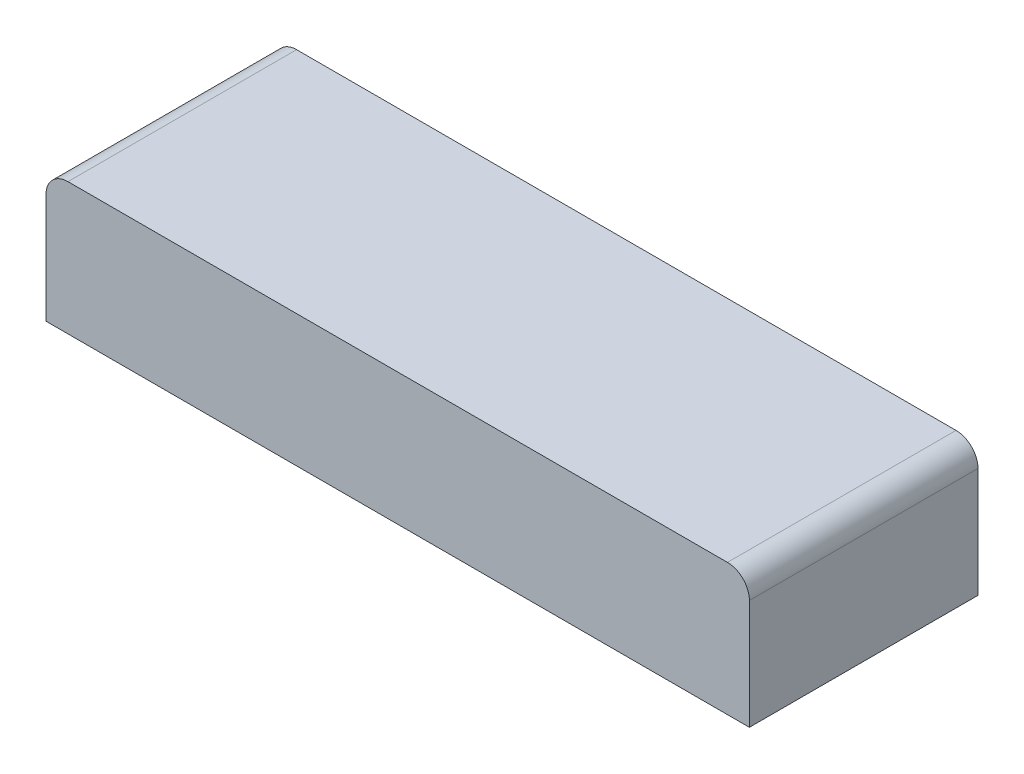
ISO-10303-21;
HEADER;
FILE_DESCRIPTION(('STEP AP214'),'2;1');
FILE_NAME('part.step','',(''),(''),'','','');
FILE_SCHEMA(('AUTOMOTIVE_DESIGN { 1 0 10303 214 1 1 1 1 }'));
ENDSEC;
DATA;
#1=APPLICATION_CONTEXT('core data for automotive mechanical design processes');
#2=APPLICATION_PROTOCOL_DEFINITION('international standard','automotive_design',2000,#1);
#3=PRODUCT_CONTEXT('',#1,'mechanical');
#4=PRODUCT('Part','Part','',(#3));
#5=PRODUCT_RELATED_PRODUCT_CATEGORY('part','',(#4));
#6=PRODUCT_DEFINITION_FORMATION('','',#4);
#7=PRODUCT_DEFINITION_CONTEXT('part definition',#1,'design');
#8=PRODUCT_DEFINITION('design','',#6,#7);
#9=PRODUCT_DEFINITION_SHAPE('','',#8);
#10=(LENGTH_UNIT() NAMED_UNIT(*) SI_UNIT(.MILLI.,.METRE.));
#11=(NAMED_UNIT(*) PLANE_ANGLE_UNIT() SI_UNIT($,.RADIAN.));
#12=(NAMED_UNIT(*) SI_UNIT($,.STERADIAN.) SOLID_ANGLE_UNIT());
#13=UNCERTAINTY_MEASURE_WITH_UNIT(LENGTH_MEASURE(1.E-05),#10,'distance_accuracy_value','');
#14=(GEOMETRIC_REPRESENTATION_CONTEXT(3) GLOBAL_UNCERTAINTY_ASSIGNED_CONTEXT((#13)) GLOBAL_UNIT_ASSIGNED_CONTEXT((#10,
#11,#12)) REPRESENTATION_CONTEXT('',''));
#15=CARTESIAN_POINT('',(0.,0.,0.));
#16=DIRECTION('',(0.,0.,1.));
#17=DIRECTION('',(1.,0.,0.));
#18=AXIS2_PLACEMENT_3D('',#15,#16,#17);
#19=CARTESIAN_POINT('',(11.500006908199,-7.300000791134,0.));
#20=DIRECTION('',(0.,0.,1.));
#21=DIRECTION('',(1.,0.,0.));
#22=AXIS2_PLACEMENT_3D('',#19,#20,#21);
#23=CYLINDRICAL_SURFACE('',#22,0.1);
#24=CARTESIAN_POINT('',(11.500006908199,-7.300000791134,1.07));
#25=DIRECTION('',(0.,0.,1.));
#26=DIRECTION('',(1.,0.,0.));
#27=AXIS2_PLACEMENT_3D('',#24,#25,#26);
#28=CIRCLE('',#27,0.1);
#29=CARTESIAN_POINT('',(11.4000069300541,-7.300000795505,1.07));
#30=VERTEX_POINT('',#29);
#31=CARTESIAN_POINT('',(11.5000069038275,-7.2000007911343,1.07));
#32=VERTEX_POINT('',#31);
#33=EDGE_CURVE('E106',#30,#32,#28,.F.);
#34=ORIENTED_EDGE('',*,*,#33,.T.);
#35=DIRECTION('',(0.,0.,1.));
#36=VECTOR('',#35,1.);
#37=CARTESIAN_POINT('',(11.500006899456,-7.20000079113461,0.));
#38=LINE('',#37,#36);
#39=CARTESIAN_POINT('',(11.5000069038275,-7.2000006600003,0.03));
#40=VERTEX_POINT('',#39);
#41=EDGE_CURVE('E123',#40,#32,#38,.T.);
#42=ORIENTED_EDGE('',*,*,#41,.F.);
#43=CARTESIAN_POINT('',(11.500006908199,-7.300000791134,0.03));
#44=DIRECTION('',(0.,0.,1.));
#45=DIRECTION('',(1.,0.,0.));
#46=AXIS2_PLACEMENT_3D('',#43,#44,#45);
#47=CIRCLE('',#46,0.1);
#48=CARTESIAN_POINT('',(11.4000069081986,-7.300000795505,0.03));
#49=VERTEX_POINT('',#48);
#50=EDGE_CURVE('E91',#40,#49,#47,.T.);
#51=ORIENTED_EDGE('',*,*,#50,.T.);
#52=DIRECTION('',(0.,0.,1.));
#53=VECTOR('',#52,1.);
#54=CARTESIAN_POINT('',(11.4000069081983,-7.300000799876,0.));
#55=LINE('',#54,#53);
#56=EDGE_CURVE('E79',#30,#49,#55,.F.);
#57=ORIENTED_EDGE('',*,*,#56,.F.);
#58=EDGE_LOOP('',(#34,#42,#51,#57));
#59=FACE_BOUND('',#58,.T.);
#60=ADVANCED_FACE('F17',(#59),#23,.T.);
#61=CARTESIAN_POINT('',(14.600006899456,-7.200000520124,0.));
#62=DIRECTION('',(-8.74227765734797E-08,0.999999999999996,0.));
#63=DIRECTION('',(-0.999999999999996,-8.74227765734797E-08,0.));
#64=AXIS2_PLACEMENT_3D('',#61,#62,#63);
#65=PLANE('',#64);
#66=DIRECTION('',(-1.,0.,0.));
#67=VECTOR('',#66,1.);
#68=CARTESIAN_POINT('',(13.000006969395,-7.200000791134,1.07));
#69=LINE('',#68,#67);
#70=CARTESIAN_POINT('',(14.5000069038275,-7.20000066,1.07));
#71=VERTEX_POINT('',#70);
#72=EDGE_CURVE('E105',#32,#71,#69,.F.);
#73=ORIENTED_EDGE('',*,*,#72,.T.);
#74=DIRECTION('',(0.,0.,1.));
#75=VECTOR('',#74,1.);
#76=CARTESIAN_POINT('',(14.500006899456,-7.200000528866,0.));
#77=LINE('',#76,#75);
#78=CARTESIAN_POINT('',(14.5000069038275,-7.200000528866,0.03));
#79=VERTEX_POINT('',#78);
#80=EDGE_CURVE('E121',#79,#71,#77,.T.);
#81=ORIENTED_EDGE('',*,*,#80,.F.);
#82=DIRECTION('',(1.,0.,0.));
#83=VECTOR('',#82,1.);
#84=CARTESIAN_POINT('',(13.000006969395,-7.200000528866,0.03));
#85=LINE('',#84,#83);
#86=EDGE_CURVE('E76',#79,#40,#85,.F.);
#87=ORIENTED_EDGE('',*,*,#86,.T.);
#88=ORIENTED_EDGE('',*,*,#41,.T.);
#89=EDGE_LOOP('',(#73,#81,#87,#88));
#90=FACE_BOUND('',#89,.T.);
#91=ADVANCED_FACE('F142',(#90),#65,.T.);
#92=CARTESIAN_POINT('',(14.500006908199,-7.300000528866,0.));
#93=DIRECTION('',(0.,0.,1.));
#94=DIRECTION('',(1.,0.,0.));
#95=AXIS2_PLACEMENT_3D('',#92,#93,#94);
#96=CYLINDRICAL_SURFACE('',#95,0.1);
#97=CARTESIAN_POINT('',(14.500006908199,-7.300000528866,1.07));
#98=DIRECTION('',(0.,0.,1.));
#99=DIRECTION('',(1.,0.,0.));
#100=AXIS2_PLACEMENT_3D('',#97,#98,#99);
#101=CIRCLE('',#100,0.1);
#102=CARTESIAN_POINT('',(14.6000069081989,-7.300000524495,1.07));
#103=VERTEX_POINT('',#102);
#104=EDGE_CURVE('E83',#71,#103,#101,.F.);
#105=ORIENTED_EDGE('',*,*,#104,.T.);
#106=DIRECTION('',(0.,0.,1.));
#107=VECTOR('',#106,1.);
#108=CARTESIAN_POINT('',(14.6000069081988,-7.300000520124,0.));
#109=LINE('',#108,#107);
#110=CARTESIAN_POINT('',(14.6000069081988,-7.30000052012386,0.03));
#111=VERTEX_POINT('',#110);
#112=EDGE_CURVE('E80',#111,#103,#109,.T.);
#113=ORIENTED_EDGE('',*,*,#112,.F.);
#114=CARTESIAN_POINT('',(14.500006908199,-7.300000528866,0.03));
#115=DIRECTION('',(0.,0.,1.));
#116=DIRECTION('',(1.,0.,0.));
#117=AXIS2_PLACEMENT_3D('',#114,#115,#116);
#118=CIRCLE('',#117,0.1);
#119=EDGE_CURVE('E20',#111,#79,#118,.T.);
#120=ORIENTED_EDGE('',*,*,#119,.T.);
#121=ORIENTED_EDGE('',*,*,#80,.T.);
#122=EDGE_LOOP('',(#105,#113,#120,#121));
#123=FACE_BOUND('',#122,.T.);
#124=ADVANCED_FACE('F81',(#123),#96,.T.);
#125=CARTESIAN_POINT('',(11.400006899456,-7.200000799876,0.));
#126=DIRECTION('',(-0.999999999999996,-8.74227765734797E-08,0.));
#127=DIRECTION('',(8.74227765734797E-08,-0.999999999999996,0.));
#128=AXIS2_PLACEMENT_3D('',#125,#126,#127);
#129=PLANE('',#128);
#130=ORIENTED_EDGE('',*,*,#56,.T.);
#131=DIRECTION('',(0.,1.,0.));
#132=VECTOR('',#131,1.);
#133=CARTESIAN_POINT('',(11.400006908199,-8.00000066,0.03));
#134=LINE('',#133,#132);
#135=CARTESIAN_POINT('',(11.400006933697,-7.8000007998764,0.03));
#136=VERTEX_POINT('',#135);
#137=EDGE_CURVE('E89',#49,#136,#134,.F.);
#138=ORIENTED_EDGE('',*,*,#137,.T.);
#139=DIRECTION('',(0.,0.,1.));
#140=VECTOR('',#139,1.);
#141=CARTESIAN_POINT('',(11.40000695191,-7.80000079987661,0.55));
#142=LINE('',#141,#140);
#143=CARTESIAN_POINT('',(11.4000069519099,-7.8000006600003,1.07));
#144=VERTEX_POINT('',#143);
#145=EDGE_CURVE('E101',#144,#136,#142,.F.);
#146=ORIENTED_EDGE('',*,*,#145,.F.);
#147=DIRECTION('',(0.,1.,0.));
#148=VECTOR('',#147,1.);
#149=CARTESIAN_POINT('',(11.40000695191,-8.00000066,1.07));
#150=LINE('',#149,#148);
#151=EDGE_CURVE('E84',#144,#30,#150,.T.);
#152=ORIENTED_EDGE('',*,*,#151,.T.);
#153=EDGE_LOOP('',(#130,#138,#146,#152));
#154=FACE_BOUND('',#153,.T.);
#155=ADVANCED_FACE('F138',(#154),#129,.T.);
#156=CARTESIAN_POINT('',(13.000006969395,-8.00000066,0.03));
#157=DIRECTION('',(0.,0.,1.));
#158=DIRECTION('',(1.,0.,0.));
#159=AXIS2_PLACEMENT_3D('',#156,#157,#158);
#160=PLANE('',#159);
#161=ORIENTED_EDGE('',*,*,#137,.F.);
#162=ORIENTED_EDGE('',*,*,#50,.F.);
#163=ORIENTED_EDGE('',*,*,#86,.F.);
#164=ORIENTED_EDGE('',*,*,#119,.F.);
#165=DIRECTION('',(-8.74227765734797E-08,0.999999999999996,0.));
#166=VECTOR('',#165,1.);
#167=CARTESIAN_POINT('',(14.600007039333,-8.800000520124,0.03));
#168=LINE('',#167,#166);
#169=CARTESIAN_POINT('',(14.6000069519101,-7.80000059006183,0.03));
#170=VERTEX_POINT('',#169);
#171=EDGE_CURVE('E73',#170,#111,#168,.T.);
#172=ORIENTED_EDGE('',*,*,#171,.F.);
#173=DIRECTION('',(0.999999999999996,8.74227765734797E-08,0.));
#174=VECTOR('',#173,1.);
#175=CARTESIAN_POINT('',(14.50000695191,-7.800000528866,0.03));
#176=LINE('',#175,#174);
#177=EDGE_CURVE('E99',#136,#170,#176,.T.);
#178=ORIENTED_EDGE('',*,*,#177,.F.);
#179=EDGE_LOOP('',(#161,#162,#163,#164,#172,#178));
#180=FACE_BOUND('',#179,.T.);
#181=ADVANCED_FACE('F70',(#180),#160,.F.);
#182=CARTESIAN_POINT('',(14.600007039333,-8.800000520124,0.));
#183=DIRECTION('',(0.999999999999996,8.74227765734797E-08,0.));
#184=DIRECTION('',(-8.74227765734797E-08,0.999999999999996,0.));
#185=AXIS2_PLACEMENT_3D('',#182,#183,#184);
#186=PLANE('',#185);
#187=ORIENTED_EDGE('',*,*,#112,.T.);
#188=DIRECTION('',(0.,1.,0.));
#189=VECTOR('',#188,1.);
#190=CARTESIAN_POINT('',(14.600006908199,-8.00000066,1.07));
#191=LINE('',#190,#189);
#192=CARTESIAN_POINT('',(14.600006908199,-7.800000520124,1.07));
#193=VERTEX_POINT('',#192);
#194=EDGE_CURVE('E35',#103,#193,#191,.F.);
#195=ORIENTED_EDGE('',*,*,#194,.T.);
#196=DIRECTION('',(0.,0.,1.));
#197=VECTOR('',#196,1.);
#198=CARTESIAN_POINT('',(14.60000695191,-7.80000052012372,0.55));
#199=LINE('',#198,#197);
#200=EDGE_CURVE('E26',#170,#193,#199,.T.);
#201=ORIENTED_EDGE('',*,*,#200,.F.);
#202=ORIENTED_EDGE('',*,*,#171,.T.);
#203=EDGE_LOOP('',(#187,#195,#201,#202));
#204=FACE_BOUND('',#203,.T.);
#205=ADVANCED_FACE('F86',(#204),#186,.T.);
#206=CARTESIAN_POINT('',(13.000006969395,-8.00000066,1.07));
#207=DIRECTION('',(0.,0.,-1.));
#208=DIRECTION('',(-1.,0.,0.));
#209=AXIS2_PLACEMENT_3D('',#206,#207,#208);
#210=PLANE('',#209);
#211=ORIENTED_EDGE('',*,*,#194,.F.);
#212=ORIENTED_EDGE('',*,*,#104,.F.);
#213=ORIENTED_EDGE('',*,*,#72,.F.);
#214=ORIENTED_EDGE('',*,*,#33,.F.);
#215=ORIENTED_EDGE('',*,*,#151,.F.);
#216=DIRECTION('',(0.999999999999996,8.74227765734797E-08,0.));
#217=VECTOR('',#216,1.);
#218=CARTESIAN_POINT('',(14.50000695191,-7.800000528866,1.07));
#219=LINE('',#218,#217);
#220=EDGE_CURVE('E11',#193,#144,#219,.F.);
#221=ORIENTED_EDGE('',*,*,#220,.F.);
#222=EDGE_LOOP('',(#211,#212,#213,#214,#215,#221));
#223=FACE_BOUND('',#222,.T.);
#224=ADVANCED_FACE('F141',(#223),#210,.F.);
#225=CARTESIAN_POINT('',(14.50000695191,-7.800000528866,0.55));
#226=DIRECTION('',(8.74227765734797E-08,-0.999999999999996,0.));
#227=DIRECTION('',(0.999999999999996,8.74227765734797E-08,0.));
#228=AXIS2_PLACEMENT_3D('',#225,#226,#227);
#229=PLANE('',#228);
#230=ORIENTED_EDGE('',*,*,#200,.T.);
#231=ORIENTED_EDGE('',*,*,#220,.T.);
#232=ORIENTED_EDGE('',*,*,#145,.T.);
#233=ORIENTED_EDGE('',*,*,#177,.T.);
#234=EDGE_LOOP('',(#230,#231,#232,#233));
#235=FACE_BOUND('',#234,.T.);
#236=ADVANCED_FACE('F143',(#235),#229,.T.);
#237=CLOSED_SHELL('',(#60,#91,#124,#155,#181,#205,#224,#236));
#238=MANIFOLD_SOLID_BREP('B1',#237);
#239=ADVANCED_BREP_SHAPE_REPRESENTATION('',(#18,#238),#14);
#240=SHAPE_DEFINITION_REPRESENTATION(#9,#239);
ENDSEC;
END-ISO-10303-21;
